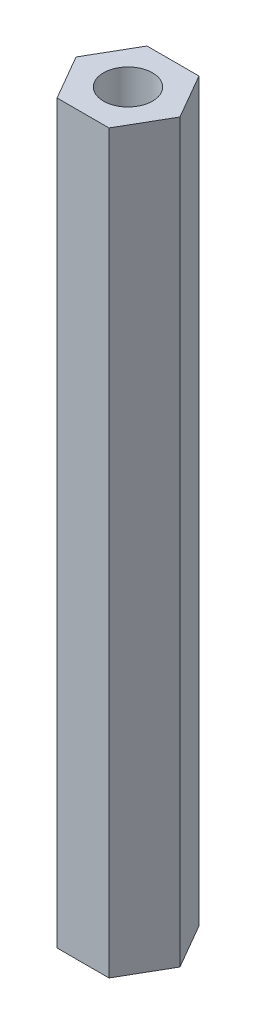
ISO-10303-21;
HEADER;
FILE_DESCRIPTION(('STEP AP214'),'2;1');
FILE_NAME('part.step','',(''),(''),'','','');
FILE_SCHEMA(('AUTOMOTIVE_DESIGN { 1 0 10303 214 1 1 1 1 }'));
ENDSEC;
DATA;
#1=APPLICATION_CONTEXT('core data for automotive mechanical design processes');
#2=APPLICATION_PROTOCOL_DEFINITION('international standard','automotive_design',2000,#1);
#3=PRODUCT_CONTEXT('',#1,'mechanical');
#4=PRODUCT('Part','Part','',(#3));
#5=PRODUCT_RELATED_PRODUCT_CATEGORY('part','',(#4));
#6=PRODUCT_DEFINITION_FORMATION('','',#4);
#7=PRODUCT_DEFINITION_CONTEXT('part definition',#1,'design');
#8=PRODUCT_DEFINITION('design','',#6,#7);
#9=PRODUCT_DEFINITION_SHAPE('','',#8);
#10=(LENGTH_UNIT() NAMED_UNIT(*) SI_UNIT(.MILLI.,.METRE.));
#11=(NAMED_UNIT(*) PLANE_ANGLE_UNIT() SI_UNIT($,.RADIAN.));
#12=(NAMED_UNIT(*) SI_UNIT($,.STERADIAN.) SOLID_ANGLE_UNIT());
#13=UNCERTAINTY_MEASURE_WITH_UNIT(LENGTH_MEASURE(1.E-05),#10,'distance_accuracy_value','');
#14=(GEOMETRIC_REPRESENTATION_CONTEXT(3) GLOBAL_UNCERTAINTY_ASSIGNED_CONTEXT((#13)) GLOBAL_UNIT_ASSIGNED_CONTEXT((#10,
#11,#12)) REPRESENTATION_CONTEXT('',''));
#15=CARTESIAN_POINT('',(0.,0.,0.));
#16=DIRECTION('',(0.,0.,1.));
#17=DIRECTION('',(1.,0.,0.));
#18=AXIS2_PLACEMENT_3D('',#15,#16,#17);
#19=CARTESIAN_POINT('',(1.5877132402715,45.,2.74999999999997));
#20=DIRECTION('',(-0.866025403784441,0.,-0.499999999999995));
#21=DIRECTION('',(-0.499999999999995,0.,0.866025403784442));
#22=AXIS2_PLACEMENT_3D('',#19,#20,#21);
#23=PLANE('',#22);
#24=DIRECTION('',(0.499999999999995,0.,-0.866025403784441));
#25=VECTOR('',#24,1.);
#26=CARTESIAN_POINT('',(1.5877132402715,0.,2.74999999999997));
#27=LINE('',#26,#25);
#28=CARTESIAN_POINT('',(1.5877132402715,0.,2.74999999999997));
#29=VERTEX_POINT('',#28);
#30=CARTESIAN_POINT('',(3.17542648054293,0.,0.));
#31=VERTEX_POINT('',#30);
#32=EDGE_CURVE('E117',#29,#31,#27,.T.);
#33=ORIENTED_EDGE('',*,*,#32,.T.);
#34=DIRECTION('',(0.,-1.,0.));
#35=VECTOR('',#34,1.);
#36=CARTESIAN_POINT('',(3.17542648054293,45.,0.));
#37=LINE('',#36,#35);
#38=CARTESIAN_POINT('',(3.17542648054293,45.,0.));
#39=VERTEX_POINT('',#38);
#40=EDGE_CURVE('E11',#39,#31,#37,.T.);
#41=ORIENTED_EDGE('',*,*,#40,.F.);
#42=DIRECTION('',(0.499999999999995,0.,-0.866025403784441));
#43=VECTOR('',#42,1.);
#44=CARTESIAN_POINT('',(1.5877132402715,45.,2.74999999999997));
#45=LINE('',#44,#43);
#46=CARTESIAN_POINT('',(1.5877132402715,45.,2.74999999999997));
#47=VERTEX_POINT('',#46);
#48=EDGE_CURVE('E128',#47,#39,#45,.T.);
#49=ORIENTED_EDGE('',*,*,#48,.F.);
#50=DIRECTION('',(0.,-1.,0.));
#51=VECTOR('',#50,1.);
#52=CARTESIAN_POINT('',(1.5877132402715,45.,2.74999999999997));
#53=LINE('',#52,#51);
#54=EDGE_CURVE('E113',#47,#29,#53,.T.);
#55=ORIENTED_EDGE('',*,*,#54,.T.);
#56=EDGE_LOOP('',(#33,#41,#49,#55));
#57=FACE_BOUND('',#56,.T.);
#58=ADVANCED_FACE('F33',(#57),#23,.F.);
#59=CARTESIAN_POINT('',(3.17542648054293,45.,0.));
#60=DIRECTION('',(-0.866025403784438,0.,0.500000000000001));
#61=DIRECTION('',(0.500000000000001,0.,0.866025403784438));
#62=AXIS2_PLACEMENT_3D('',#59,#60,#61);
#63=PLANE('',#62);
#64=DIRECTION('',(-0.500000000000001,0.,-0.866025403784438));
#65=VECTOR('',#64,1.);
#66=CARTESIAN_POINT('',(3.17542648054293,0.,0.));
#67=LINE('',#66,#65);
#68=CARTESIAN_POINT('',(1.58771324027146,0.,-2.74999999999999));
#69=VERTEX_POINT('',#68);
#70=EDGE_CURVE('E120',#31,#69,#67,.T.);
#71=ORIENTED_EDGE('',*,*,#70,.T.);
#72=DIRECTION('',(0.,-1.,0.));
#73=VECTOR('',#72,1.);
#74=CARTESIAN_POINT('',(1.58771324027146,45.,-2.74999999999999));
#75=LINE('',#74,#73);
#76=CARTESIAN_POINT('',(1.58771324027146,45.,-2.74999999999999));
#77=VERTEX_POINT('',#76);
#78=EDGE_CURVE('E41',#77,#69,#75,.T.);
#79=ORIENTED_EDGE('',*,*,#78,.F.);
#80=DIRECTION('',(-0.500000000000001,0.,-0.866025403784438));
#81=VECTOR('',#80,1.);
#82=CARTESIAN_POINT('',(3.17542648054293,45.,0.));
#83=LINE('',#82,#81);
#84=EDGE_CURVE('E86',#39,#77,#83,.T.);
#85=ORIENTED_EDGE('',*,*,#84,.F.);
#86=ORIENTED_EDGE('',*,*,#40,.T.);
#87=EDGE_LOOP('',(#71,#79,#85,#86));
#88=FACE_BOUND('',#87,.T.);
#89=ADVANCED_FACE('F153',(#88),#63,.F.);
#90=CARTESIAN_POINT('',(1.58771324027146,45.,-2.74999999999999));
#91=DIRECTION('',(0.,0.,1.));
#92=DIRECTION('',(1.,0.,0.));
#93=AXIS2_PLACEMENT_3D('',#90,#91,#92);
#94=PLANE('',#93);
#95=DIRECTION('',(-1.,0.,0.));
#96=VECTOR('',#95,1.);
#97=CARTESIAN_POINT('',(1.58771324027146,0.,-2.74999999999999));
#98=LINE('',#97,#96);
#99=CARTESIAN_POINT('',(-1.58771324027148,0.,-2.74999999999998));
#100=VERTEX_POINT('',#99);
#101=EDGE_CURVE('E123',#69,#100,#98,.T.);
#102=ORIENTED_EDGE('',*,*,#101,.T.);
#103=DIRECTION('',(0.,-1.,0.));
#104=VECTOR('',#103,1.);
#105=CARTESIAN_POINT('',(-1.58771324027148,45.,-2.74999999999998));
#106=LINE('',#105,#104);
#107=CARTESIAN_POINT('',(-1.58771324027148,45.,-2.74999999999998));
#108=VERTEX_POINT('',#107);
#109=EDGE_CURVE('E108',#108,#100,#106,.T.);
#110=ORIENTED_EDGE('',*,*,#109,.F.);
#111=DIRECTION('',(-1.,0.,0.));
#112=VECTOR('',#111,1.);
#113=CARTESIAN_POINT('',(1.58771324027146,45.,-2.74999999999999));
#114=LINE('',#113,#112);
#115=EDGE_CURVE('E99',#77,#108,#114,.T.);
#116=ORIENTED_EDGE('',*,*,#115,.F.);
#117=ORIENTED_EDGE('',*,*,#78,.T.);
#118=EDGE_LOOP('',(#102,#110,#116,#117));
#119=FACE_BOUND('',#118,.T.);
#120=ADVANCED_FACE('F134',(#119),#94,.F.);
#121=CARTESIAN_POINT('',(-1.58771324027148,45.,-2.74999999999998));
#122=DIRECTION('',(0.866025403784441,0.,0.499999999999995));
#123=DIRECTION('',(0.499999999999995,0.,-0.866025403784442));
#124=AXIS2_PLACEMENT_3D('',#121,#122,#123);
#125=PLANE('',#124);
#126=DIRECTION('',(-0.499999999999995,0.,0.866025403784442));
#127=VECTOR('',#126,1.);
#128=CARTESIAN_POINT('',(-1.58771324027148,0.,-2.74999999999998));
#129=LINE('',#128,#127);
#130=CARTESIAN_POINT('',(-3.17542648054293,0.,0.));
#131=VERTEX_POINT('',#130);
#132=EDGE_CURVE('E107',#100,#131,#129,.T.);
#133=ORIENTED_EDGE('',*,*,#132,.T.);
#134=DIRECTION('',(0.,-1.,0.));
#135=VECTOR('',#134,1.);
#136=CARTESIAN_POINT('',(-3.17542648054293,45.,0.));
#137=LINE('',#136,#135);
#138=CARTESIAN_POINT('',(-3.17542648054293,45.,0.));
#139=VERTEX_POINT('',#138);
#140=EDGE_CURVE('E104',#139,#131,#137,.T.);
#141=ORIENTED_EDGE('',*,*,#140,.F.);
#142=DIRECTION('',(-0.499999999999995,0.,0.866025403784442));
#143=VECTOR('',#142,1.);
#144=CARTESIAN_POINT('',(-1.58771324027148,45.,-2.74999999999998));
#145=LINE('',#144,#143);
#146=EDGE_CURVE('E93',#108,#139,#145,.T.);
#147=ORIENTED_EDGE('',*,*,#146,.F.);
#148=ORIENTED_EDGE('',*,*,#109,.T.);
#149=EDGE_LOOP('',(#133,#141,#147,#148));
#150=FACE_BOUND('',#149,.T.);
#151=ADVANCED_FACE('F105',(#150),#125,.F.);
#152=CARTESIAN_POINT('',(-3.17542648054293,45.,0.));
#153=DIRECTION('',(0.866025403784434,0.,-0.500000000000007));
#154=DIRECTION('',(-0.500000000000007,0.,-0.866025403784435));
#155=AXIS2_PLACEMENT_3D('',#152,#153,#154);
#156=PLANE('',#155);
#157=DIRECTION('',(0.500000000000007,0.,0.866025403784435));
#158=VECTOR('',#157,1.);
#159=CARTESIAN_POINT('',(-3.17542648054293,0.,0.));
#160=LINE('',#159,#158);
#161=CARTESIAN_POINT('',(-1.58771324027144,0.,2.75));
#162=VERTEX_POINT('',#161);
#163=EDGE_CURVE('E72',#131,#162,#160,.T.);
#164=ORIENTED_EDGE('',*,*,#163,.T.);
#165=DIRECTION('',(0.,-1.,0.));
#166=VECTOR('',#165,1.);
#167=CARTESIAN_POINT('',(-1.58771324027144,45.,2.75));
#168=LINE('',#167,#166);
#169=CARTESIAN_POINT('',(-1.58771324027144,45.,2.75));
#170=VERTEX_POINT('',#169);
#171=EDGE_CURVE('E109',#170,#162,#168,.T.);
#172=ORIENTED_EDGE('',*,*,#171,.F.);
#173=DIRECTION('',(0.500000000000007,0.,0.866025403784435));
#174=VECTOR('',#173,1.);
#175=CARTESIAN_POINT('',(-3.17542648054293,45.,0.));
#176=LINE('',#175,#174);
#177=EDGE_CURVE('E97',#139,#170,#176,.T.);
#178=ORIENTED_EDGE('',*,*,#177,.F.);
#179=ORIENTED_EDGE('',*,*,#140,.T.);
#180=EDGE_LOOP('',(#164,#172,#178,#179));
#181=FACE_BOUND('',#180,.T.);
#182=ADVANCED_FACE('F111',(#181),#156,.F.);
#183=CARTESIAN_POINT('',(-1.58771324027144,45.,2.75));
#184=DIRECTION('',(0.,0.,-1.));
#185=DIRECTION('',(-1.,0.,0.));
#186=AXIS2_PLACEMENT_3D('',#183,#184,#185);
#187=PLANE('',#186);
#188=DIRECTION('',(1.,0.,0.));
#189=VECTOR('',#188,1.);
#190=CARTESIAN_POINT('',(-1.58771324027144,0.,2.75));
#191=LINE('',#190,#189);
#192=EDGE_CURVE('E78',#162,#29,#191,.T.);
#193=ORIENTED_EDGE('',*,*,#192,.T.);
#194=ORIENTED_EDGE('',*,*,#54,.F.);
#195=DIRECTION('',(1.,0.,0.));
#196=VECTOR('',#195,1.);
#197=CARTESIAN_POINT('',(-1.58771324027144,45.,2.75));
#198=LINE('',#197,#196);
#199=EDGE_CURVE('E49',#170,#47,#198,.T.);
#200=ORIENTED_EDGE('',*,*,#199,.F.);
#201=ORIENTED_EDGE('',*,*,#171,.T.);
#202=EDGE_LOOP('',(#193,#194,#200,#201));
#203=FACE_BOUND('',#202,.T.);
#204=ADVANCED_FACE('F141',(#203),#187,.F.);
#205=CARTESIAN_POINT('',(0.,45.,0.));
#206=DIRECTION('',(0.,1.,0.));
#207=DIRECTION('',(0.,0.,1.));
#208=AXIS2_PLACEMENT_3D('',#205,#206,#207);
#209=PLANE('',#208);
#210=CARTESIAN_POINT('',(0.,45.,0.));
#211=DIRECTION('',(0.,1.,0.));
#212=DIRECTION('',(0.,0.,1.));
#213=AXIS2_PLACEMENT_3D('',#210,#211,#212);
#214=CIRCLE('',#213,1.5);
#215=CARTESIAN_POINT('',(0.,45.,1.5));
#216=VERTEX_POINT('',#215);
#217=EDGE_CURVE('E236',#216,#216,#214,.T.);
#218=ORIENTED_EDGE('',*,*,#217,.F.);
#219=EDGE_LOOP('',(#218));
#220=FACE_BOUND('',#219,.T.);
#221=ORIENTED_EDGE('',*,*,#48,.T.);
#222=ORIENTED_EDGE('',*,*,#84,.T.);
#223=ORIENTED_EDGE('',*,*,#115,.T.);
#224=ORIENTED_EDGE('',*,*,#146,.T.);
#225=ORIENTED_EDGE('',*,*,#177,.T.);
#226=ORIENTED_EDGE('',*,*,#199,.T.);
#227=EDGE_LOOP('',(#221,#222,#223,#224,#225,#226));
#228=FACE_BOUND('',#227,.T.);
#229=ADVANCED_FACE('F95',(#220,#228),#209,.T.);
#230=CARTESIAN_POINT('',(0.,0.,0.));
#231=DIRECTION('',(0.,1.,0.));
#232=DIRECTION('',(0.,0.,1.));
#233=AXIS2_PLACEMENT_3D('',#230,#231,#232);
#234=PLANE('',#233);
#235=CARTESIAN_POINT('',(0.,0.,0.));
#236=DIRECTION('',(0.,1.,0.));
#237=DIRECTION('',(0.,0.,1.));
#238=AXIS2_PLACEMENT_3D('',#235,#236,#237);
#239=CIRCLE('',#238,1.5);
#240=CARTESIAN_POINT('',(0.,0.,1.5));
#241=VERTEX_POINT('',#240);
#242=EDGE_CURVE('E237',#241,#241,#239,.T.);
#243=ORIENTED_EDGE('',*,*,#242,.T.);
#244=EDGE_LOOP('',(#243));
#245=FACE_BOUND('',#244,.T.);
#246=ORIENTED_EDGE('',*,*,#32,.F.);
#247=ORIENTED_EDGE('',*,*,#192,.F.);
#248=ORIENTED_EDGE('',*,*,#163,.F.);
#249=ORIENTED_EDGE('',*,*,#132,.F.);
#250=ORIENTED_EDGE('',*,*,#101,.F.);
#251=ORIENTED_EDGE('',*,*,#70,.F.);
#252=EDGE_LOOP('',(#246,#247,#248,#249,#250,#251));
#253=FACE_BOUND('',#252,.T.);
#254=ADVANCED_FACE('F137',(#245,#253),#234,.F.);
#255=CARTESIAN_POINT('',(0.,35.,0.));
#256=DIRECTION('',(0.,1.,0.));
#257=DIRECTION('',(0.,0.,1.));
#258=AXIS2_PLACEMENT_3D('',#255,#256,#257);
#259=CYLINDRICAL_SURFACE('',#258,1.5);
#260=CARTESIAN_POINT('',(0.,35.,0.));
#261=DIRECTION('',(0.,1.,0.));
#262=DIRECTION('',(0.,0.,1.));
#263=AXIS2_PLACEMENT_3D('',#260,#261,#262);
#264=CIRCLE('',#263,1.5);
#265=CARTESIAN_POINT('',(0.,35.,1.5));
#266=VERTEX_POINT('',#265);
#267=EDGE_CURVE('E121',#266,#266,#264,.T.);
#268=ORIENTED_EDGE('',*,*,#267,.F.);
#269=EDGE_LOOP('',(#268));
#270=FACE_BOUND('',#269,.T.);
#271=ORIENTED_EDGE('',*,*,#217,.T.);
#272=EDGE_LOOP('',(#271));
#273=FACE_BOUND('',#272,.T.);
#274=ADVANCED_FACE('F188',(#270,#273),#259,.F.);
#275=CARTESIAN_POINT('',(0.,35.,0.));
#276=DIRECTION('',(0.,1.,0.));
#277=DIRECTION('',(0.,0.,1.));
#278=AXIS2_PLACEMENT_3D('',#275,#276,#277);
#279=PLANE('',#278);
#280=ORIENTED_EDGE('',*,*,#267,.T.);
#281=EDGE_LOOP('',(#280));
#282=FACE_BOUND('',#281,.T.);
#283=ADVANCED_FACE('F193',(#282),#279,.T.);
#284=CARTESIAN_POINT('',(0.,10.,0.));
#285=DIRECTION('',(0.,-1.,0.));
#286=DIRECTION('',(0.,0.,-1.));
#287=AXIS2_PLACEMENT_3D('',#284,#285,#286);
#288=CYLINDRICAL_SURFACE('',#287,1.5);
#289=CARTESIAN_POINT('',(0.,10.,0.));
#290=DIRECTION('',(0.,1.,0.));
#291=DIRECTION('',(0.,0.,1.));
#292=AXIS2_PLACEMENT_3D('',#289,#290,#291);
#293=CIRCLE('',#292,1.5);
#294=CARTESIAN_POINT('',(0.,10.,1.5));
#295=VERTEX_POINT('',#294);
#296=EDGE_CURVE('E235',#295,#295,#293,.T.);
#297=ORIENTED_EDGE('',*,*,#296,.T.);
#298=EDGE_LOOP('',(#297));
#299=FACE_BOUND('',#298,.T.);
#300=ORIENTED_EDGE('',*,*,#242,.F.);
#301=EDGE_LOOP('',(#300));
#302=FACE_BOUND('',#301,.T.);
#303=ADVANCED_FACE('F203',(#299,#302),#288,.F.);
#304=CARTESIAN_POINT('',(0.,10.,0.));
#305=DIRECTION('',(0.,-1.,0.));
#306=DIRECTION('',(0.,0.,1.));
#307=AXIS2_PLACEMENT_3D('',#304,#305,#306);
#308=PLANE('',#307);
#309=ORIENTED_EDGE('',*,*,#296,.F.);
#310=EDGE_LOOP('',(#309));
#311=FACE_BOUND('',#310,.T.);
#312=ADVANCED_FACE('F219',(#311),#308,.T.);
#313=CLOSED_SHELL('',(#58,#89,#120,#151,#182,#204,#229,#254,#274,#283,#303,#312));
#314=MANIFOLD_SOLID_BREP('B2',#313);
#315=ADVANCED_BREP_SHAPE_REPRESENTATION('',(#18,#314),#14);
#316=SHAPE_DEFINITION_REPRESENTATION(#9,#315);
ENDSEC;
END-ISO-10303-21;
